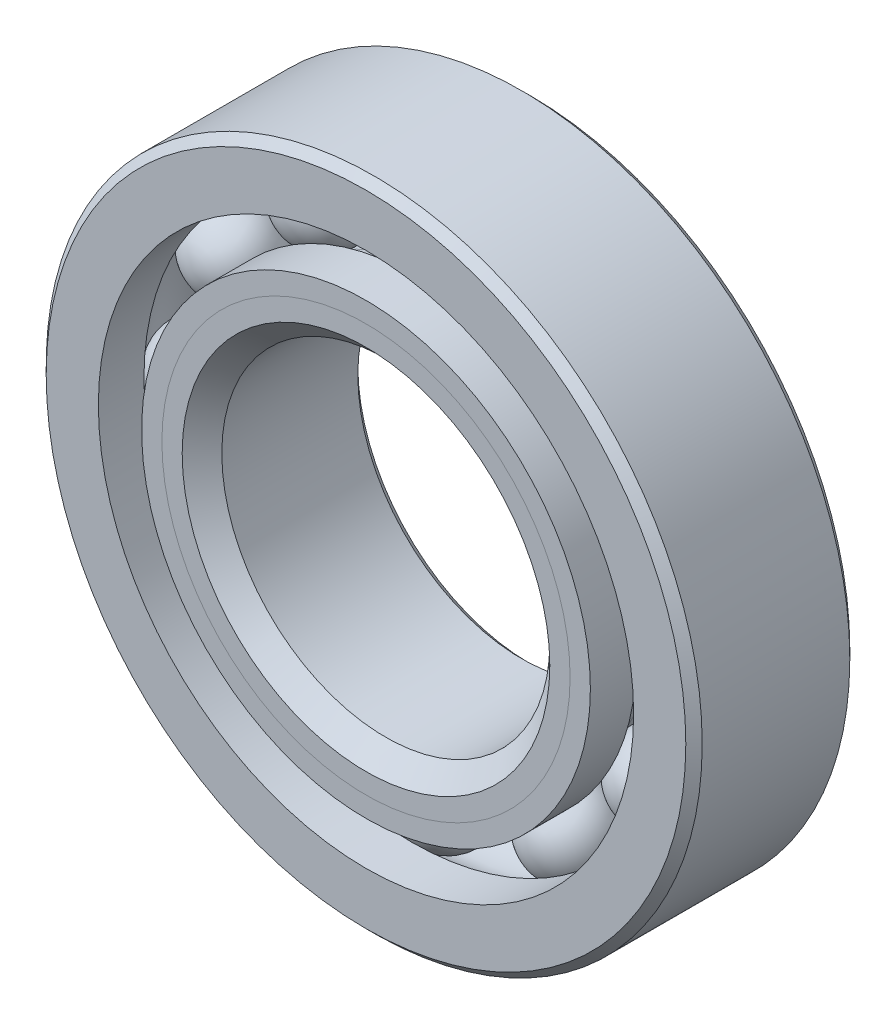
ISO-10303-21;
HEADER;
FILE_DESCRIPTION(('STEP AP214'),'2;1');
FILE_NAME('part.step','',(''),(''),'','','');
FILE_SCHEMA(('AUTOMOTIVE_DESIGN { 1 0 10303 214 1 1 1 1 }'));
ENDSEC;
DATA;
#1=APPLICATION_CONTEXT('core data for automotive mechanical design processes');
#2=APPLICATION_PROTOCOL_DEFINITION('international standard','automotive_design',2000,#1);
#3=PRODUCT_CONTEXT('',#1,'mechanical');
#4=PRODUCT('Part','Part','',(#3));
#5=PRODUCT_RELATED_PRODUCT_CATEGORY('part','',(#4));
#6=PRODUCT_DEFINITION_FORMATION('','',#4);
#7=PRODUCT_DEFINITION_CONTEXT('part definition',#1,'design');
#8=PRODUCT_DEFINITION('design','',#6,#7);
#9=PRODUCT_DEFINITION_SHAPE('','',#8);
#10=(LENGTH_UNIT() NAMED_UNIT(*) SI_UNIT(.MILLI.,.METRE.));
#11=(NAMED_UNIT(*) PLANE_ANGLE_UNIT() SI_UNIT($,.RADIAN.));
#12=(NAMED_UNIT(*) SI_UNIT($,.STERADIAN.) SOLID_ANGLE_UNIT());
#13=UNCERTAINTY_MEASURE_WITH_UNIT(LENGTH_MEASURE(1.E-05),#10,'distance_accuracy_value','');
#14=(GEOMETRIC_REPRESENTATION_CONTEXT(3) GLOBAL_UNCERTAINTY_ASSIGNED_CONTEXT((#13)) GLOBAL_UNIT_ASSIGNED_CONTEXT((#10,
#11,#12)) REPRESENTATION_CONTEXT('',''));
#15=CARTESIAN_POINT('',(0.,0.,0.));
#16=DIRECTION('',(0.,0.,1.));
#17=DIRECTION('',(1.,0.,0.));
#18=AXIS2_PLACEMENT_3D('',#15,#16,#17);
#19=CARTESIAN_POINT('',(-11.9062499999997,20.6222299276171,0.));
#20=DIRECTION('',(0.,0.,1.));
#21=DIRECTION('',(-0.499999999999989,0.866025403784445,0.));
#22=AXIS2_PLACEMENT_3D('',#19,#20,#21);
#23=SPHERICAL_SURFACE('',#22,4.10214178383694);
#24=CARTESIAN_POINT('',(-11.9062499999997,20.6222299276171,4.10214178383694));
#25=VERTEX_POINT('',#24);
#26=VERTEX_LOOP('',#25);
#27=FACE_BOUND('',#26,.T.);
#28=ADVANCED_FACE('F37',(#27),#23,.T.);
#29=CLOSED_SHELL('',(#28));
#30=MANIFOLD_SOLID_BREP('B2',#29);
#31=CARTESIAN_POINT('',(-20.6222299276168,11.9062500000002,0.));
#32=DIRECTION('',(0.,0.,1.));
#33=DIRECTION('',(-0.866025403784433,0.50000000000001,0.));
#34=AXIS2_PLACEMENT_3D('',#31,#32,#33);
#35=SPHERICAL_SURFACE('',#34,4.10214178383694);
#36=CARTESIAN_POINT('',(-20.6222299276168,11.9062500000002,4.10214178383694));
#37=VERTEX_POINT('',#36);
#38=VERTEX_LOOP('',#37);
#39=FACE_BOUND('',#38,.T.);
#40=ADVANCED_FACE('F68',(#39),#35,.T.);
#41=CLOSED_SHELL('',(#40));
#42=MANIFOLD_SOLID_BREP('B6',#41);
#43=CARTESIAN_POINT('',(-23.8125,2.49422698143606E-13,0.));
#44=DIRECTION('',(0.,0.,1.));
#45=DIRECTION('',(-1.,0.,0.));
#46=AXIS2_PLACEMENT_3D('',#43,#44,#45);
#47=SPHERICAL_SURFACE('',#46,4.10214178383694);
#48=CARTESIAN_POINT('',(-23.8125,2.49422698143606E-13,4.10214178383694));
#49=VERTEX_POINT('',#48);
#50=VERTEX_LOOP('',#49);
#51=FACE_BOUND('',#50,.T.);
#52=ADVANCED_FACE('F99',(#51),#47,.T.);
#53=CLOSED_SHELL('',(#52));
#54=MANIFOLD_SOLID_BREP('B33',#53);
#55=CARTESIAN_POINT('',(-20.6222299276171,-11.9062499999998,0.));
#56=DIRECTION('',(0.,0.,1.));
#57=DIRECTION('',(-0.866025403784443,-0.499999999999992,0.));
#58=AXIS2_PLACEMENT_3D('',#55,#56,#57);
#59=SPHERICAL_SURFACE('',#58,4.10214178383694);
#60=CARTESIAN_POINT('',(-20.6222299276171,-11.9062499999998,4.10214178383694));
#61=VERTEX_POINT('',#60);
#62=VERTEX_LOOP('',#61);
#63=FACE_BOUND('',#62,.T.);
#64=ADVANCED_FACE('F130',(#63),#59,.T.);
#65=CLOSED_SHELL('',(#64));
#66=MANIFOLD_SOLID_BREP('B64',#65);
#67=CARTESIAN_POINT('',(-11.9062500000002,-20.6222299276168,0.));
#68=DIRECTION('',(0.,0.,1.));
#69=DIRECTION('',(-0.500000000000007,-0.866025403784435,0.));
#70=AXIS2_PLACEMENT_3D('',#67,#68,#69);
#71=SPHERICAL_SURFACE('',#70,4.10214178383694);
#72=CARTESIAN_POINT('',(-11.9062500000002,-20.6222299276168,4.10214178383694));
#73=VERTEX_POINT('',#72);
#74=VERTEX_LOOP('',#73);
#75=FACE_BOUND('',#74,.T.);
#76=ADVANCED_FACE('F161',(#75),#71,.T.);
#77=CLOSED_SHELL('',(#76));
#78=MANIFOLD_SOLID_BREP('B95',#77);
#79=CARTESIAN_POINT('',(-1.66281798762404E-13,-23.8125,0.));
#80=DIRECTION('',(0.,0.,1.));
#81=DIRECTION('',(0.,-1.,0.));
#82=AXIS2_PLACEMENT_3D('',#79,#80,#81);
#83=SPHERICAL_SURFACE('',#82,4.10214178383694);
#84=CARTESIAN_POINT('',(-1.66281798762404E-13,-23.8125,4.10214178383694));
#85=VERTEX_POINT('',#84);
#86=VERTEX_LOOP('',#85);
#87=FACE_BOUND('',#86,.T.);
#88=ADVANCED_FACE('F192',(#87),#83,.T.);
#89=CLOSED_SHELL('',(#88));
#90=MANIFOLD_SOLID_BREP('B126',#89);
#91=CARTESIAN_POINT('',(11.9062499999999,-20.622229927617,0.));
#92=DIRECTION('',(0.,0.,1.));
#93=DIRECTION('',(0.499999999999995,-0.866025403784442,0.));
#94=AXIS2_PLACEMENT_3D('',#91,#92,#93);
#95=SPHERICAL_SURFACE('',#94,4.10214178383694);
#96=CARTESIAN_POINT('',(11.9062499999999,-20.622229927617,4.10214178383694));
#97=VERTEX_POINT('',#96);
#98=VERTEX_LOOP('',#97);
#99=FACE_BOUND('',#98,.T.);
#100=ADVANCED_FACE('F223',(#99),#95,.T.);
#101=CLOSED_SHELL('',(#100));
#102=MANIFOLD_SOLID_BREP('B157',#101);
#103=CARTESIAN_POINT('',(20.6222299276169,-11.9062500000001,0.));
#104=DIRECTION('',(0.,0.,1.));
#105=DIRECTION('',(0.866025403784436,-0.500000000000004,0.));
#106=AXIS2_PLACEMENT_3D('',#103,#104,#105);
#107=SPHERICAL_SURFACE('',#106,4.10214178383694);
#108=CARTESIAN_POINT('',(20.6222299276169,-11.9062500000001,4.10214178383694));
#109=VERTEX_POINT('',#108);
#110=VERTEX_LOOP('',#109);
#111=FACE_BOUND('',#110,.T.);
#112=ADVANCED_FACE('F254',(#111),#107,.T.);
#113=CLOSED_SHELL('',(#112));
#114=MANIFOLD_SOLID_BREP('B188',#113);
#115=CARTESIAN_POINT('',(23.8125,0.,0.));
#116=DIRECTION('',(0.,0.,1.));
#117=DIRECTION('',(1.,0.,0.));
#118=AXIS2_PLACEMENT_3D('',#115,#116,#117);
#119=SPHERICAL_SURFACE('',#118,4.10214178383694);
#120=CARTESIAN_POINT('',(23.8125,0.,4.10214178383694));
#121=VERTEX_POINT('',#120);
#122=VERTEX_LOOP('',#121);
#123=FACE_BOUND('',#122,.T.);
#124=ADVANCED_FACE('F285',(#123),#119,.T.);
#125=CLOSED_SHELL('',(#124));
#126=MANIFOLD_SOLID_BREP('B219',#125);
#127=CARTESIAN_POINT('',(20.622229927617,11.90625,0.));
#128=DIRECTION('',(0.,0.,1.));
#129=DIRECTION('',(0.86602540378444,0.499999999999998,0.));
#130=AXIS2_PLACEMENT_3D('',#127,#128,#129);
#131=SPHERICAL_SURFACE('',#130,4.10214178383694);
#132=CARTESIAN_POINT('',(20.622229927617,11.90625,4.10214178383694));
#133=VERTEX_POINT('',#132);
#134=VERTEX_LOOP('',#133);
#135=FACE_BOUND('',#134,.T.);
#136=ADVANCED_FACE('F316',(#135),#131,.T.);
#137=CLOSED_SHELL('',(#136));
#138=MANIFOLD_SOLID_BREP('B250',#137);
#139=CARTESIAN_POINT('',(11.90625,20.6222299276169,0.));
#140=DIRECTION('',(0.,0.,1.));
#141=DIRECTION('',(0.500000000000001,0.866025403784438,0.));
#142=AXIS2_PLACEMENT_3D('',#139,#140,#141);
#143=SPHERICAL_SURFACE('',#142,4.10214178383694);
#144=CARTESIAN_POINT('',(11.90625,20.6222299276169,4.10214178383694));
#145=VERTEX_POINT('',#144);
#146=VERTEX_LOOP('',#145);
#147=FACE_BOUND('',#146,.T.);
#148=ADVANCED_FACE('F347',(#147),#143,.T.);
#149=CLOSED_SHELL('',(#148));
#150=MANIFOLD_SOLID_BREP('B281',#149);
#151=CARTESIAN_POINT('',(0.,23.8125,0.));
#152=DIRECTION('',(0.,0.,1.));
#153=DIRECTION('',(0.,1.,0.));
#154=AXIS2_PLACEMENT_3D('',#151,#152,#153);
#155=SPHERICAL_SURFACE('',#154,4.10214178383694);
#156=CARTESIAN_POINT('',(0.,23.8125,4.10214178383694));
#157=VERTEX_POINT('',#156);
#158=VERTEX_LOOP('',#157);
#159=FACE_BOUND('',#158,.T.);
#160=ADVANCED_FACE('F380',(#159),#155,.T.);
#161=CLOSED_SHELL('',(#160));
#162=MANIFOLD_SOLID_BREP('B312',#161);
#163=CARTESIAN_POINT('',(0.,19.7558862573375,7.9375));
#164=DIRECTION('',(0.,0.,-1.));
#165=DIRECTION('',(-1.,0.,0.));
#166=AXIS2_PLACEMENT_3D('',#163,#164,#165);
#167=PLANE('',#166);
#168=CARTESIAN_POINT('',(0.,0.,7.9375));
#169=DIRECTION('',(0.,0.,1.));
#170=DIRECTION('',(1.,0.,0.));
#171=AXIS2_PLACEMENT_3D('',#168,#169,#170);
#172=CIRCLE('',#171,17.7926791080815);
#173=CARTESIAN_POINT('',(17.7926791080815,0.,7.9375));
#174=VERTEX_POINT('',#173);
#175=EDGE_CURVE('E434',#174,#174,#172,.T.);
#176=ORIENTED_EDGE('',*,*,#175,.F.);
#177=EDGE_LOOP('',(#176));
#178=FACE_BOUND('',#177,.T.);
#179=CARTESIAN_POINT('',(0.,0.,7.9375));
#180=DIRECTION('',(0.,0.,1.));
#181=DIRECTION('',(1.,0.,0.));
#182=AXIS2_PLACEMENT_3D('',#179,#180,#181);
#183=CIRCLE('',#182,19.7558862573375);
#184=CARTESIAN_POINT('',(19.7558862573375,0.,7.9375));
#185=VERTEX_POINT('',#184);
#186=EDGE_CURVE('E379',#185,#185,#183,.T.);
#187=ORIENTED_EDGE('',*,*,#186,.T.);
#188=EDGE_LOOP('',(#187));
#189=FACE_BOUND('',#188,.T.);
#190=ADVANCED_FACE('F400',(#178,#189),#167,.F.);
#191=CARTESIAN_POINT('',(0.,0.,5.97429285074407));
#192=DIRECTION('',(0.,0.,1.));
#193=DIRECTION('',(1.,0.,0.));
#194=AXIS2_PLACEMENT_3D('',#191,#192,#193);
#195=CONICAL_SURFACE('',#194,17.7926791080815,0.78539816339745);
#196=ORIENTED_EDGE('',*,*,#186,.F.);
#197=EDGE_LOOP('',(#196));
#198=FACE_BOUND('',#197,.T.);
#199=CARTESIAN_POINT('',(0.,0.,5.97429285074407));
#200=DIRECTION('',(0.,0.,1.));
#201=DIRECTION('',(1.,0.,0.));
#202=AXIS2_PLACEMENT_3D('',#199,#200,#201);
#203=CIRCLE('',#202,17.7926791080815);
#204=CARTESIAN_POINT('',(17.7926791080815,0.,5.97429285074407));
#205=VERTEX_POINT('',#204);
#206=EDGE_CURVE('E406',#205,#205,#203,.T.);
#207=ORIENTED_EDGE('',*,*,#206,.T.);
#208=EDGE_LOOP('',(#207));
#209=FACE_BOUND('',#208,.T.);
#210=ADVANCED_FACE('F441',(#198,#209),#195,.T.);
#211=CARTESIAN_POINT('',(0.,0.,7.9375));
#212=DIRECTION('',(0.,0.,1.));
#213=DIRECTION('',(1.,0.,0.));
#214=AXIS2_PLACEMENT_3D('',#211,#212,#213);
#215=CYLINDRICAL_SURFACE('',#214,17.7926791080815);
#216=ORIENTED_EDGE('',*,*,#206,.F.);
#217=EDGE_LOOP('',(#216));
#218=FACE_BOUND('',#217,.T.);
#219=CARTESIAN_POINT('',(0.,0.,0.));
#220=DIRECTION('',(0.,0.,1.));
#221=DIRECTION('',(1.,0.,0.));
#222=AXIS2_PLACEMENT_3D('',#219,#220,#221);
#223=CIRCLE('',#222,17.7926791080815);
#224=CARTESIAN_POINT('',(17.7926791080815,0.,0.));
#225=VERTEX_POINT('',#224);
#226=EDGE_CURVE('E410',#225,#225,#223,.T.);
#227=ORIENTED_EDGE('',*,*,#226,.T.);
#228=EDGE_LOOP('',(#227));
#229=FACE_BOUND('',#228,.T.);
#230=ADVANCED_FACE('F445',(#218,#229),#215,.T.);
#231=CARTESIAN_POINT('',(0.,17.7926791080815,0.));
#232=DIRECTION('',(0.,0.,-1.));
#233=DIRECTION('',(-1.,0.,0.));
#234=AXIS2_PLACEMENT_3D('',#231,#232,#233);
#235=PLANE('',#234);
#236=ORIENTED_EDGE('',*,*,#226,.F.);
#237=EDGE_LOOP('',(#236));
#238=FACE_BOUND('',#237,.T.);
#239=CARTESIAN_POINT('',(0.,0.,0.));
#240=DIRECTION('',(0.,0.,1.));
#241=DIRECTION('',(1.,0.,0.));
#242=AXIS2_PLACEMENT_3D('',#239,#240,#241);
#243=CIRCLE('',#242,19.7103582161631);
#244=CARTESIAN_POINT('',(19.7103582161631,0.,0.));
#245=VERTEX_POINT('',#244);
#246=EDGE_CURVE('E414',#245,#245,#243,.T.);
#247=ORIENTED_EDGE('',*,*,#246,.T.);
#248=EDGE_LOOP('',(#247));
#249=FACE_BOUND('',#248,.T.);
#250=ADVANCED_FACE('F450',(#238,#249),#235,.F.);
#251=CARTESIAN_POINT('',(0.,0.,0.));
#252=DIRECTION('',(0.,0.,1.));
#253=DIRECTION('',(1.,0.,0.));
#254=AXIS2_PLACEMENT_3D('',#251,#252,#253);
#255=TOROIDAL_SURFACE('',#254,23.8125,4.10214178383694);
#256=ORIENTED_EDGE('',*,*,#246,.F.);
#257=EDGE_LOOP('',(#256));
#258=FACE_BOUND('',#257,.T.);
#259=CARTESIAN_POINT('',(0.,0.,-3.52777777777778));
#260=DIRECTION('',(0.,0.,1.));
#261=DIRECTION('',(1.,0.,0.));
#262=AXIS2_PLACEMENT_3D('',#259,#260,#261);
#263=CIRCLE('',#262,21.7190934065934);
#264=CARTESIAN_POINT('',(21.7190934065934,0.,-3.52777777777778));
#265=VERTEX_POINT('',#264);
#266=EDGE_CURVE('E419',#265,#265,#263,.T.);
#267=ORIENTED_EDGE('',*,*,#266,.T.);
#268=EDGE_LOOP('',(#267));
#269=FACE_BOUND('',#268,.T.);
#270=ADVANCED_FACE('F456',(#258,#269),#255,.F.);
#271=CARTESIAN_POINT('',(0.,0.,7.9375));
#272=DIRECTION('',(0.,0.,1.));
#273=DIRECTION('',(1.,0.,0.));
#274=AXIS2_PLACEMENT_3D('',#271,#272,#273);
#275=CYLINDRICAL_SURFACE('',#274,21.7190934065934);
#276=ORIENTED_EDGE('',*,*,#266,.F.);
#277=EDGE_LOOP('',(#276));
#278=FACE_BOUND('',#277,.T.);
#279=CARTESIAN_POINT('',(0.,0.,-7.9375));
#280=DIRECTION('',(0.,0.,1.));
#281=DIRECTION('',(1.,0.,0.));
#282=AXIS2_PLACEMENT_3D('',#279,#280,#281);
#283=CIRCLE('',#282,21.7190934065934);
#284=CARTESIAN_POINT('',(21.7190934065934,0.,-7.9375));
#285=VERTEX_POINT('',#284);
#286=EDGE_CURVE('E422',#285,#285,#283,.T.);
#287=ORIENTED_EDGE('',*,*,#286,.T.);
#288=EDGE_LOOP('',(#287));
#289=FACE_BOUND('',#288,.T.);
#290=ADVANCED_FACE('F460',(#278,#289),#275,.T.);
#291=CARTESIAN_POINT('',(0.,16.66875,-7.9375));
#292=DIRECTION('',(0.,0.,1.));
#293=DIRECTION('',(1.,0.,0.));
#294=AXIS2_PLACEMENT_3D('',#291,#292,#293);
#295=PLANE('',#294);
#296=ORIENTED_EDGE('',*,*,#286,.F.);
#297=EDGE_LOOP('',(#296));
#298=FACE_BOUND('',#297,.T.);
#299=CARTESIAN_POINT('',(0.,0.,-7.9375));
#300=DIRECTION('',(0.,0.,1.));
#301=DIRECTION('',(1.,0.,0.));
#302=AXIS2_PLACEMENT_3D('',#299,#300,#301);
#303=CIRCLE('',#302,16.66875);
#304=CARTESIAN_POINT('',(16.66875,0.,-7.9375));
#305=VERTEX_POINT('',#304);
#306=EDGE_CURVE('E425',#305,#305,#303,.T.);
#307=ORIENTED_EDGE('',*,*,#306,.T.);
#308=EDGE_LOOP('',(#307));
#309=FACE_BOUND('',#308,.T.);
#310=ADVANCED_FACE('F464',(#298,#309),#295,.F.);
#311=CARTESIAN_POINT('',(0.,0.,-7.14375));
#312=DIRECTION('',(0.,0.,-1.));
#313=DIRECTION('',(-1.,0.,0.));
#314=AXIS2_PLACEMENT_3D('',#311,#312,#313);
#315=CONICAL_SURFACE('',#314,15.875,0.785398163397446);
#316=ORIENTED_EDGE('',*,*,#306,.F.);
#317=EDGE_LOOP('',(#316));
#318=FACE_BOUND('',#317,.T.);
#319=CARTESIAN_POINT('',(0.,0.,-7.14375));
#320=DIRECTION('',(0.,0.,1.));
#321=DIRECTION('',(1.,0.,0.));
#322=AXIS2_PLACEMENT_3D('',#319,#320,#321);
#323=CIRCLE('',#322,15.875);
#324=CARTESIAN_POINT('',(15.875,0.,-7.14375));
#325=VERTEX_POINT('',#324);
#326=EDGE_CURVE('E428',#325,#325,#323,.T.);
#327=ORIENTED_EDGE('',*,*,#326,.T.);
#328=EDGE_LOOP('',(#327));
#329=FACE_BOUND('',#328,.T.);
#330=ADVANCED_FACE('F468',(#318,#329),#315,.F.);
#331=CARTESIAN_POINT('',(0.,0.,7.9375));
#332=DIRECTION('',(0.,0.,1.));
#333=DIRECTION('',(1.,0.,0.));
#334=AXIS2_PLACEMENT_3D('',#331,#332,#333);
#335=CYLINDRICAL_SURFACE('',#334,15.875);
#336=ORIENTED_EDGE('',*,*,#326,.F.);
#337=EDGE_LOOP('',(#336));
#338=FACE_BOUND('',#337,.T.);
#339=CARTESIAN_POINT('',(0.,0.,6.01982089191848));
#340=DIRECTION('',(0.,0.,1.));
#341=DIRECTION('',(1.,0.,0.));
#342=AXIS2_PLACEMENT_3D('',#339,#340,#341);
#343=CIRCLE('',#342,15.875);
#344=CARTESIAN_POINT('',(15.875,0.,6.01982089191848));
#345=VERTEX_POINT('',#344);
#346=EDGE_CURVE('E431',#345,#345,#343,.T.);
#347=ORIENTED_EDGE('',*,*,#346,.T.);
#348=EDGE_LOOP('',(#347));
#349=FACE_BOUND('',#348,.T.);
#350=ADVANCED_FACE('F472',(#338,#349),#335,.F.);
#351=CARTESIAN_POINT('',(0.,0.,7.9375));
#352=DIRECTION('',(0.,0.,1.));
#353=DIRECTION('',(1.,0.,0.));
#354=AXIS2_PLACEMENT_3D('',#351,#352,#353);
#355=CONICAL_SURFACE('',#354,17.7926791080815,0.78539816339745);
#356=ORIENTED_EDGE('',*,*,#346,.F.);
#357=EDGE_LOOP('',(#356));
#358=FACE_BOUND('',#357,.T.);
#359=ORIENTED_EDGE('',*,*,#175,.T.);
#360=EDGE_LOOP('',(#359));
#361=FACE_BOUND('',#360,.T.);
#362=ADVANCED_FACE('F438',(#358,#361),#355,.F.);
#363=CLOSED_SHELL('',(#190,#210,#230,#250,#270,#290,#310,#330,#350,#362));
#364=MANIFOLD_SOLID_BREP('B343',#363);
#365=CARTESIAN_POINT('',(0.,21.7190934065934,7.9375));
#366=DIRECTION('',(0.,0.,-1.));
#367=DIRECTION('',(-1.,0.,0.));
#368=AXIS2_PLACEMENT_3D('',#365,#366,#367);
#369=PLANE('',#368);
#370=CARTESIAN_POINT('',(0.,0.,7.9375));
#371=DIRECTION('',(0.,0.,1.));
#372=DIRECTION('',(1.,0.,0.));
#373=AXIS2_PLACEMENT_3D('',#370,#371,#372);
#374=CIRCLE('',#373,19.7558862573375);
#375=CARTESIAN_POINT('',(19.7558862573375,0.,7.9375));
#376=VERTEX_POINT('',#375);
#377=EDGE_CURVE('E399',#376,#376,#374,.T.);
#378=ORIENTED_EDGE('',*,*,#377,.F.);
#379=EDGE_LOOP('',(#378));
#380=FACE_BOUND('',#379,.T.);
#381=CARTESIAN_POINT('',(0.,0.,7.9375));
#382=DIRECTION('',(0.,0.,1.));
#383=DIRECTION('',(1.,0.,0.));
#384=AXIS2_PLACEMENT_3D('',#381,#382,#383);
#385=CIRCLE('',#384,21.7190934065934);
#386=CARTESIAN_POINT('',(21.7190934065934,0.,7.9375));
#387=VERTEX_POINT('',#386);
#388=EDGE_CURVE('E580',#387,#387,#385,.T.);
#389=ORIENTED_EDGE('',*,*,#388,.T.);
#390=EDGE_LOOP('',(#389));
#391=FACE_BOUND('',#390,.T.);
#392=ADVANCED_FACE('F558',(#380,#391),#369,.F.);
#393=CARTESIAN_POINT('',(0.,0.,7.9375));
#394=DIRECTION('',(0.,0.,1.));
#395=DIRECTION('',(1.,0.,0.));
#396=AXIS2_PLACEMENT_3D('',#393,#394,#395);
#397=CONICAL_SURFACE('',#396,19.7558862573375,0.78539816339745);
#398=CARTESIAN_POINT('',(0.,0.,5.97429285074407));
#399=DIRECTION('',(0.,0.,1.));
#400=DIRECTION('',(1.,0.,0.));
#401=AXIS2_PLACEMENT_3D('',#398,#399,#400);
#402=CIRCLE('',#401,17.7926791080815);
#403=CARTESIAN_POINT('',(17.7926791080815,0.,5.97429285074407));
#404=VERTEX_POINT('',#403);
#405=EDGE_CURVE('E564',#404,#404,#402,.T.);
#406=ORIENTED_EDGE('',*,*,#405,.F.);
#407=EDGE_LOOP('',(#406));
#408=FACE_BOUND('',#407,.T.);
#409=ORIENTED_EDGE('',*,*,#377,.T.);
#410=EDGE_LOOP('',(#409));
#411=FACE_BOUND('',#410,.T.);
#412=ADVANCED_FACE('F605',(#408,#411),#397,.F.);
#413=CARTESIAN_POINT('',(0.,0.,7.9375));
#414=DIRECTION('',(0.,0.,1.));
#415=DIRECTION('',(1.,0.,0.));
#416=AXIS2_PLACEMENT_3D('',#413,#414,#415);
#417=CYLINDRICAL_SURFACE('',#416,17.7926791080815);
#418=CARTESIAN_POINT('',(0.,0.,0.));
#419=DIRECTION('',(0.,0.,1.));
#420=DIRECTION('',(1.,0.,0.));
#421=AXIS2_PLACEMENT_3D('',#418,#419,#420);
#422=CIRCLE('',#421,17.7926791080815);
#423=CARTESIAN_POINT('',(17.7926791080815,0.,0.));
#424=VERTEX_POINT('',#423);
#425=EDGE_CURVE('E568',#424,#424,#422,.T.);
#426=ORIENTED_EDGE('',*,*,#425,.F.);
#427=EDGE_LOOP('',(#426));
#428=FACE_BOUND('',#427,.T.);
#429=ORIENTED_EDGE('',*,*,#405,.T.);
#430=EDGE_LOOP('',(#429));
#431=FACE_BOUND('',#430,.T.);
#432=ADVANCED_FACE('F600',(#428,#431),#417,.F.);
#433=CARTESIAN_POINT('',(0.,17.7926791080815,0.));
#434=DIRECTION('',(0.,0.,1.));
#435=DIRECTION('',(1.,0.,0.));
#436=AXIS2_PLACEMENT_3D('',#433,#434,#435);
#437=PLANE('',#436);
#438=CARTESIAN_POINT('',(0.,0.,0.));
#439=DIRECTION('',(0.,0.,1.));
#440=DIRECTION('',(1.,0.,0.));
#441=AXIS2_PLACEMENT_3D('',#438,#439,#440);
#442=CIRCLE('',#441,19.7103582161631);
#443=CARTESIAN_POINT('',(19.7103582161631,0.,0.));
#444=VERTEX_POINT('',#443);
#445=EDGE_CURVE('E572',#444,#444,#442,.T.);
#446=ORIENTED_EDGE('',*,*,#445,.F.);
#447=EDGE_LOOP('',(#446));
#448=FACE_BOUND('',#447,.T.);
#449=ORIENTED_EDGE('',*,*,#425,.T.);
#450=EDGE_LOOP('',(#449));
#451=FACE_BOUND('',#450,.T.);
#452=ADVANCED_FACE('F594',(#448,#451),#437,.F.);
#453=CARTESIAN_POINT('',(0.,0.,0.));
#454=DIRECTION('',(0.,0.,1.));
#455=DIRECTION('',(1.,0.,0.));
#456=AXIS2_PLACEMENT_3D('',#453,#454,#455);
#457=TOROIDAL_SURFACE('',#456,23.8125,4.10214178383694);
#458=CARTESIAN_POINT('',(0.,0.,3.52777777777778));
#459=DIRECTION('',(0.,0.,1.));
#460=DIRECTION('',(1.,0.,0.));
#461=AXIS2_PLACEMENT_3D('',#458,#459,#460);
#462=CIRCLE('',#461,21.7190934065934);
#463=CARTESIAN_POINT('',(21.7190934065934,0.,3.52777777777778));
#464=VERTEX_POINT('',#463);
#465=EDGE_CURVE('E577',#464,#464,#462,.T.);
#466=ORIENTED_EDGE('',*,*,#465,.F.);
#467=EDGE_LOOP('',(#466));
#468=FACE_BOUND('',#467,.T.);
#469=ORIENTED_EDGE('',*,*,#445,.T.);
#470=EDGE_LOOP('',(#469));
#471=FACE_BOUND('',#470,.T.);
#472=ADVANCED_FACE('F588',(#468,#471),#457,.F.);
#473=CARTESIAN_POINT('',(0.,0.,7.9375));
#474=DIRECTION('',(0.,0.,1.));
#475=DIRECTION('',(1.,0.,0.));
#476=AXIS2_PLACEMENT_3D('',#473,#474,#475);
#477=CYLINDRICAL_SURFACE('',#476,21.7190934065934);
#478=ORIENTED_EDGE('',*,*,#388,.F.);
#479=EDGE_LOOP('',(#478));
#480=FACE_BOUND('',#479,.T.);
#481=ORIENTED_EDGE('',*,*,#465,.T.);
#482=EDGE_LOOP('',(#481));
#483=FACE_BOUND('',#482,.T.);
#484=ADVANCED_FACE('F585',(#480,#483),#477,.T.);
#485=CLOSED_SHELL('',(#392,#412,#432,#452,#472,#484));
#486=MANIFOLD_SOLID_BREP('B374',#485);
#487=CARTESIAN_POINT('',(0.,0.,7.14375));
#488=DIRECTION('',(0.,0.,-1.));
#489=DIRECTION('',(-1.,0.,0.));
#490=AXIS2_PLACEMENT_3D('',#487,#488,#489);
#491=CONICAL_SURFACE('',#490,31.75,0.785398163397446);
#492=CARTESIAN_POINT('',(0.,0.,7.9375));
#493=DIRECTION('',(0.,0.,1.));
#494=DIRECTION('',(1.,0.,0.));
#495=AXIS2_PLACEMENT_3D('',#492,#493,#494);
#496=CIRCLE('',#495,30.95625);
#497=CARTESIAN_POINT('',(30.95625,0.,7.9375));
#498=VERTEX_POINT('',#497);
#499=EDGE_CURVE('E677',#498,#498,#496,.T.);
#500=ORIENTED_EDGE('',*,*,#499,.F.);
#501=EDGE_LOOP('',(#500));
#502=FACE_BOUND('',#501,.T.);
#503=CARTESIAN_POINT('',(0.,0.,7.14375));
#504=DIRECTION('',(0.,0.,1.));
#505=DIRECTION('',(1.,0.,0.));
#506=AXIS2_PLACEMENT_3D('',#503,#504,#505);
#507=CIRCLE('',#506,31.75);
#508=CARTESIAN_POINT('',(31.75,0.,7.14375));
#509=VERTEX_POINT('',#508);
#510=EDGE_CURVE('E557',#509,#509,#507,.T.);
#511=ORIENTED_EDGE('',*,*,#510,.T.);
#512=EDGE_LOOP('',(#511));
#513=FACE_BOUND('',#512,.T.);
#514=ADVANCED_FACE('F649',(#502,#513),#491,.T.);
#515=CARTESIAN_POINT('',(0.,0.,7.9375));
#516=DIRECTION('',(0.,0.,1.));
#517=DIRECTION('',(1.,0.,0.));
#518=AXIS2_PLACEMENT_3D('',#515,#516,#517);
#519=CYLINDRICAL_SURFACE('',#518,31.75);
#520=ORIENTED_EDGE('',*,*,#510,.F.);
#521=EDGE_LOOP('',(#520));
#522=FACE_BOUND('',#521,.T.);
#523=CARTESIAN_POINT('',(0.,0.,-7.14375));
#524=DIRECTION('',(0.,0.,1.));
#525=DIRECTION('',(1.,0.,0.));
#526=AXIS2_PLACEMENT_3D('',#523,#524,#525);
#527=CIRCLE('',#526,31.75);
#528=CARTESIAN_POINT('',(31.75,0.,-7.14375));
#529=VERTEX_POINT('',#528);
#530=EDGE_CURVE('E655',#529,#529,#527,.T.);
#531=ORIENTED_EDGE('',*,*,#530,.T.);
#532=EDGE_LOOP('',(#531));
#533=FACE_BOUND('',#532,.T.);
#534=ADVANCED_FACE('F684',(#522,#533),#519,.T.);
#535=CARTESIAN_POINT('',(0.,0.,-7.9375));
#536=DIRECTION('',(0.,0.,1.));
#537=DIRECTION('',(1.,0.,0.));
#538=AXIS2_PLACEMENT_3D('',#535,#536,#537);
#539=CONICAL_SURFACE('',#538,30.95625,0.785398163397444);
#540=ORIENTED_EDGE('',*,*,#530,.F.);
#541=EDGE_LOOP('',(#540));
#542=FACE_BOUND('',#541,.T.);
#543=CARTESIAN_POINT('',(0.,0.,-7.9375));
#544=DIRECTION('',(0.,0.,1.));
#545=DIRECTION('',(1.,0.,0.));
#546=AXIS2_PLACEMENT_3D('',#543,#544,#545);
#547=CIRCLE('',#546,30.95625);
#548=CARTESIAN_POINT('',(30.95625,0.,-7.9375));
#549=VERTEX_POINT('',#548);
#550=EDGE_CURVE('E659',#549,#549,#547,.T.);
#551=ORIENTED_EDGE('',*,*,#550,.T.);
#552=EDGE_LOOP('',(#551));
#553=FACE_BOUND('',#552,.T.);
#554=ADVANCED_FACE('F688',(#542,#553),#539,.T.);
#555=CARTESIAN_POINT('',(0.,30.95625,-7.9375));
#556=DIRECTION('',(0.,0.,1.));
#557=DIRECTION('',(1.,0.,0.));
#558=AXIS2_PLACEMENT_3D('',#555,#556,#557);
#559=PLANE('',#558);
#560=ORIENTED_EDGE('',*,*,#550,.F.);
#561=EDGE_LOOP('',(#560));
#562=FACE_BOUND('',#561,.T.);
#563=CARTESIAN_POINT('',(0.,0.,-7.9375));
#564=DIRECTION('',(0.,0.,1.));
#565=DIRECTION('',(1.,0.,0.));
#566=AXIS2_PLACEMENT_3D('',#563,#564,#565);
#567=CIRCLE('',#566,25.9059065934066);
#568=CARTESIAN_POINT('',(25.9059065934066,0.,-7.9375));
#569=VERTEX_POINT('',#568);
#570=EDGE_CURVE('E663',#569,#569,#567,.T.);
#571=ORIENTED_EDGE('',*,*,#570,.T.);
#572=EDGE_LOOP('',(#571));
#573=FACE_BOUND('',#572,.T.);
#574=ADVANCED_FACE('F693',(#562,#573),#559,.F.);
#575=CARTESIAN_POINT('',(0.,0.,7.9375));
#576=DIRECTION('',(0.,0.,1.));
#577=DIRECTION('',(1.,0.,0.));
#578=AXIS2_PLACEMENT_3D('',#575,#576,#577);
#579=CYLINDRICAL_SURFACE('',#578,25.9059065934066);
#580=ORIENTED_EDGE('',*,*,#570,.F.);
#581=EDGE_LOOP('',(#580));
#582=FACE_BOUND('',#581,.T.);
#583=CARTESIAN_POINT('',(0.,0.,-3.52777777777778));
#584=DIRECTION('',(0.,0.,1.));
#585=DIRECTION('',(1.,0.,0.));
#586=AXIS2_PLACEMENT_3D('',#583,#584,#585);
#587=CIRCLE('',#586,25.9059065934066);
#588=CARTESIAN_POINT('',(25.9059065934066,0.,-3.52777777777778));
#589=VERTEX_POINT('',#588);
#590=EDGE_CURVE('E668',#589,#589,#587,.T.);
#591=ORIENTED_EDGE('',*,*,#590,.T.);
#592=EDGE_LOOP('',(#591));
#593=FACE_BOUND('',#592,.T.);
#594=ADVANCED_FACE('F699',(#582,#593),#579,.F.);
#595=CARTESIAN_POINT('',(0.,0.,0.));
#596=DIRECTION('',(0.,0.,1.));
#597=DIRECTION('',(1.,0.,0.));
#598=AXIS2_PLACEMENT_3D('',#595,#596,#597);
#599=TOROIDAL_SURFACE('',#598,23.8125,4.10214178383694);
#600=ORIENTED_EDGE('',*,*,#590,.F.);
#601=EDGE_LOOP('',(#600));
#602=FACE_BOUND('',#601,.T.);
#603=CARTESIAN_POINT('',(0.,0.,3.52777777777778));
#604=DIRECTION('',(0.,0.,1.));
#605=DIRECTION('',(1.,0.,0.));
#606=AXIS2_PLACEMENT_3D('',#603,#604,#605);
#607=CIRCLE('',#606,25.9059065934066);
#608=CARTESIAN_POINT('',(25.9059065934066,0.,3.52777777777778));
#609=VERTEX_POINT('',#608);
#610=EDGE_CURVE('E671',#609,#609,#607,.T.);
#611=ORIENTED_EDGE('',*,*,#610,.T.);
#612=EDGE_LOOP('',(#611));
#613=FACE_BOUND('',#612,.T.);
#614=ADVANCED_FACE('F703',(#602,#613),#599,.F.);
#615=CARTESIAN_POINT('',(0.,0.,7.9375));
#616=DIRECTION('',(0.,0.,1.));
#617=DIRECTION('',(1.,0.,0.));
#618=AXIS2_PLACEMENT_3D('',#615,#616,#617);
#619=CYLINDRICAL_SURFACE('',#618,25.9059065934066);
#620=ORIENTED_EDGE('',*,*,#610,.F.);
#621=EDGE_LOOP('',(#620));
#622=FACE_BOUND('',#621,.T.);
#623=CARTESIAN_POINT('',(0.,0.,7.9375));
#624=DIRECTION('',(0.,0.,1.));
#625=DIRECTION('',(1.,0.,0.));
#626=AXIS2_PLACEMENT_3D('',#623,#624,#625);
#627=CIRCLE('',#626,25.9059065934066);
#628=CARTESIAN_POINT('',(25.9059065934066,0.,7.9375));
#629=VERTEX_POINT('',#628);
#630=EDGE_CURVE('E674',#629,#629,#627,.T.);
#631=ORIENTED_EDGE('',*,*,#630,.T.);
#632=EDGE_LOOP('',(#631));
#633=FACE_BOUND('',#632,.T.);
#634=ADVANCED_FACE('F707',(#622,#633),#619,.F.);
#635=CARTESIAN_POINT('',(0.,30.95625,7.9375));
#636=DIRECTION('',(0.,0.,-1.));
#637=DIRECTION('',(-1.,0.,0.));
#638=AXIS2_PLACEMENT_3D('',#635,#636,#637);
#639=PLANE('',#638);
#640=ORIENTED_EDGE('',*,*,#630,.F.);
#641=EDGE_LOOP('',(#640));
#642=FACE_BOUND('',#641,.T.);
#643=ORIENTED_EDGE('',*,*,#499,.T.);
#644=EDGE_LOOP('',(#643));
#645=FACE_BOUND('',#644,.T.);
#646=ADVANCED_FACE('F681',(#642,#645),#639,.F.);
#647=CLOSED_SHELL('',(#514,#534,#554,#574,#594,#614,#634,#646));
#648=MANIFOLD_SOLID_BREP('B394',#647);
#649=ADVANCED_BREP_SHAPE_REPRESENTATION('',(#18,#30,#42,#54,#66,#78,#90,#102,#114,#126,#138,
#150,#162,#364,#486,#648),#14);
#650=SHAPE_DEFINITION_REPRESENTATION(#9,#649);
ENDSEC;
END-ISO-10303-21;
